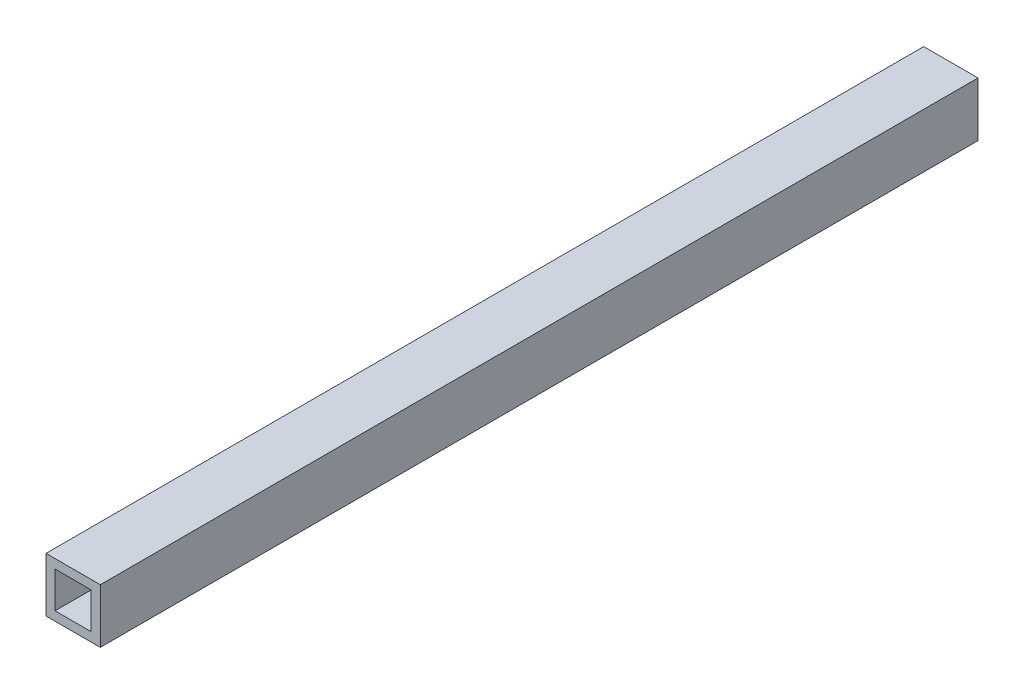
ISO-10303-21;
HEADER;
FILE_DESCRIPTION(('STEP AP214'),'2;1');
FILE_NAME('part.step','',(''),(''),'','','');
FILE_SCHEMA(('AUTOMOTIVE_DESIGN { 1 0 10303 214 1 1 1 1 }'));
ENDSEC;
DATA;
#1=APPLICATION_CONTEXT('core data for automotive mechanical design processes');
#2=APPLICATION_PROTOCOL_DEFINITION('international standard','automotive_design',2000,#1);
#3=PRODUCT_CONTEXT('',#1,'mechanical');
#4=PRODUCT('Part','Part','',(#3));
#5=PRODUCT_RELATED_PRODUCT_CATEGORY('part','',(#4));
#6=PRODUCT_DEFINITION_FORMATION('','',#4);
#7=PRODUCT_DEFINITION_CONTEXT('part definition',#1,'design');
#8=PRODUCT_DEFINITION('design','',#6,#7);
#9=PRODUCT_DEFINITION_SHAPE('','',#8);
#10=(LENGTH_UNIT() NAMED_UNIT(*) SI_UNIT(.MILLI.,.METRE.));
#11=(NAMED_UNIT(*) PLANE_ANGLE_UNIT() SI_UNIT($,.RADIAN.));
#12=(NAMED_UNIT(*) SI_UNIT($,.STERADIAN.) SOLID_ANGLE_UNIT());
#13=UNCERTAINTY_MEASURE_WITH_UNIT(LENGTH_MEASURE(1.E-05),#10,'distance_accuracy_value','');
#14=(GEOMETRIC_REPRESENTATION_CONTEXT(3) GLOBAL_UNCERTAINTY_ASSIGNED_CONTEXT((#13)) GLOBAL_UNIT_ASSIGNED_CONTEXT((#10,
#11,#12)) REPRESENTATION_CONTEXT('',''));
#15=CARTESIAN_POINT('',(0.,0.,0.));
#16=DIRECTION('',(0.,0.,1.));
#17=DIRECTION('',(1.,0.,0.));
#18=AXIS2_PLACEMENT_3D('',#15,#16,#17);
#19=CARTESIAN_POINT('',(0.,0.,153.9875));
#20=DIRECTION('',(0.,0.,-1.));
#21=DIRECTION('',(-1.,0.,0.));
#22=AXIS2_PLACEMENT_3D('',#19,#20,#21);
#23=PLANE('',#22);
#24=DIRECTION('',(0.,1.,0.));
#25=VECTOR('',#24,1.);
#26=CARTESIAN_POINT('',(9.525,-9.525,153.9875));
#27=LINE('',#26,#25);
#28=CARTESIAN_POINT('',(9.525,-9.525,153.9875));
#29=VERTEX_POINT('',#28);
#30=CARTESIAN_POINT('',(9.525,9.525,153.9875));
#31=VERTEX_POINT('',#30);
#32=EDGE_CURVE('E138',#29,#31,#27,.T.);
#33=ORIENTED_EDGE('',*,*,#32,.T.);
#34=DIRECTION('',(-1.,0.,0.));
#35=VECTOR('',#34,1.);
#36=CARTESIAN_POINT('',(-9.525,9.525,153.9875));
#37=LINE('',#36,#35);
#38=CARTESIAN_POINT('',(-9.525,9.525,153.9875));
#39=VERTEX_POINT('',#38);
#40=EDGE_CURVE('E141',#31,#39,#37,.T.);
#41=ORIENTED_EDGE('',*,*,#40,.T.);
#42=DIRECTION('',(0.,-1.,0.));
#43=VECTOR('',#42,1.);
#44=CARTESIAN_POINT('',(-9.525,-9.525,153.9875));
#45=LINE('',#44,#43);
#46=CARTESIAN_POINT('',(-9.525,-9.525,153.9875));
#47=VERTEX_POINT('',#46);
#48=EDGE_CURVE('E144',#39,#47,#45,.T.);
#49=ORIENTED_EDGE('',*,*,#48,.T.);
#50=DIRECTION('',(1.,0.,0.));
#51=VECTOR('',#50,1.);
#52=CARTESIAN_POINT('',(-9.525,-9.525,153.9875));
#53=LINE('',#52,#51);
#54=EDGE_CURVE('E146',#47,#29,#53,.T.);
#55=ORIENTED_EDGE('',*,*,#54,.T.);
#56=EDGE_LOOP('',(#33,#41,#49,#55));
#57=FACE_BOUND('',#56,.T.);
#58=DIRECTION('',(0.,1.,0.));
#59=VECTOR('',#58,1.);
#60=CARTESIAN_POINT('',(6.34999999999999,-6.34999999999999,153.9875));
#61=LINE('',#60,#59);
#62=CARTESIAN_POINT('',(6.34999999999999,-6.34999999999999,153.9875));
#63=VERTEX_POINT('',#62);
#64=CARTESIAN_POINT('',(6.34999999999999,6.35,153.9875));
#65=VERTEX_POINT('',#64);
#66=EDGE_CURVE('E102',#63,#65,#61,.T.);
#67=ORIENTED_EDGE('',*,*,#66,.F.);
#68=DIRECTION('',(1.,0.,0.));
#69=VECTOR('',#68,1.);
#70=CARTESIAN_POINT('',(-6.35,-6.34999999999999,153.9875));
#71=LINE('',#70,#69);
#72=CARTESIAN_POINT('',(-6.35,-6.34999999999999,153.9875));
#73=VERTEX_POINT('',#72);
#74=EDGE_CURVE('E124',#73,#63,#71,.T.);
#75=ORIENTED_EDGE('',*,*,#74,.F.);
#76=DIRECTION('',(0.,-1.,0.));
#77=VECTOR('',#76,1.);
#78=CARTESIAN_POINT('',(-6.35,-6.34999999999999,153.9875));
#79=LINE('',#78,#77);
#80=CARTESIAN_POINT('',(-6.35,6.35,153.9875));
#81=VERTEX_POINT('',#80);
#82=EDGE_CURVE('E122',#81,#73,#79,.T.);
#83=ORIENTED_EDGE('',*,*,#82,.F.);
#84=DIRECTION('',(-1.,0.,0.));
#85=VECTOR('',#84,1.);
#86=CARTESIAN_POINT('',(-6.35,6.35,153.9875));
#87=LINE('',#86,#85);
#88=EDGE_CURVE('E110',#65,#81,#87,.T.);
#89=ORIENTED_EDGE('',*,*,#88,.F.);
#90=EDGE_LOOP('',(#67,#75,#83,#89));
#91=FACE_BOUND('',#90,.T.);
#92=ADVANCED_FACE('F37',(#57,#91),#23,.F.);
#93=CARTESIAN_POINT('',(0.,0.,-153.9875));
#94=DIRECTION('',(0.,0.,-1.));
#95=DIRECTION('',(-1.,0.,0.));
#96=AXIS2_PLACEMENT_3D('',#93,#94,#95);
#97=PLANE('',#96);
#98=DIRECTION('',(0.,1.,0.));
#99=VECTOR('',#98,1.);
#100=CARTESIAN_POINT('',(9.525,-9.525,-153.9875));
#101=LINE('',#100,#99);
#102=CARTESIAN_POINT('',(9.525,-9.525,-153.9875));
#103=VERTEX_POINT('',#102);
#104=CARTESIAN_POINT('',(9.525,9.525,-153.9875));
#105=VERTEX_POINT('',#104);
#106=EDGE_CURVE('E118',#103,#105,#101,.T.);
#107=ORIENTED_EDGE('',*,*,#106,.F.);
#108=DIRECTION('',(1.,0.,0.));
#109=VECTOR('',#108,1.);
#110=CARTESIAN_POINT('',(-9.525,-9.525,-153.9875));
#111=LINE('',#110,#109);
#112=CARTESIAN_POINT('',(-9.525,-9.525,-153.9875));
#113=VERTEX_POINT('',#112);
#114=EDGE_CURVE('E142',#113,#103,#111,.T.);
#115=ORIENTED_EDGE('',*,*,#114,.F.);
#116=DIRECTION('',(0.,-1.,0.));
#117=VECTOR('',#116,1.);
#118=CARTESIAN_POINT('',(-9.525,-9.525,-153.9875));
#119=LINE('',#118,#117);
#120=CARTESIAN_POINT('',(-9.525,9.525,-153.9875));
#121=VERTEX_POINT('',#120);
#122=EDGE_CURVE('E153',#121,#113,#119,.T.);
#123=ORIENTED_EDGE('',*,*,#122,.F.);
#124=DIRECTION('',(-1.,0.,0.));
#125=VECTOR('',#124,1.);
#126=CARTESIAN_POINT('',(-9.525,9.525,-153.9875));
#127=LINE('',#126,#125);
#128=EDGE_CURVE('E151',#105,#121,#127,.T.);
#129=ORIENTED_EDGE('',*,*,#128,.F.);
#130=EDGE_LOOP('',(#107,#115,#123,#129));
#131=FACE_BOUND('',#130,.T.);
#132=DIRECTION('',(1.,0.,0.));
#133=VECTOR('',#132,1.);
#134=CARTESIAN_POINT('',(-6.35,-6.34999999999999,-153.9875));
#135=LINE('',#134,#133);
#136=CARTESIAN_POINT('',(-6.35,-6.34999999999999,-153.9875));
#137=VERTEX_POINT('',#136);
#138=CARTESIAN_POINT('',(6.34999999999999,-6.34999999999999,-153.9875));
#139=VERTEX_POINT('',#138);
#140=EDGE_CURVE('E111',#137,#139,#135,.T.);
#141=ORIENTED_EDGE('',*,*,#140,.T.);
#142=DIRECTION('',(0.,1.,0.));
#143=VECTOR('',#142,1.);
#144=CARTESIAN_POINT('',(6.34999999999999,-6.34999999999999,-153.9875));
#145=LINE('',#144,#143);
#146=CARTESIAN_POINT('',(6.34999999999999,6.35,-153.9875));
#147=VERTEX_POINT('',#146);
#148=EDGE_CURVE('E60',#139,#147,#145,.T.);
#149=ORIENTED_EDGE('',*,*,#148,.T.);
#150=DIRECTION('',(-1.,0.,0.));
#151=VECTOR('',#150,1.);
#152=CARTESIAN_POINT('',(-6.35,6.35,-153.9875));
#153=LINE('',#152,#151);
#154=CARTESIAN_POINT('',(-6.35,6.35,-153.9875));
#155=VERTEX_POINT('',#154);
#156=EDGE_CURVE('E117',#147,#155,#153,.T.);
#157=ORIENTED_EDGE('',*,*,#156,.T.);
#158=DIRECTION('',(0.,-1.,0.));
#159=VECTOR('',#158,1.);
#160=CARTESIAN_POINT('',(-6.35,-6.34999999999999,-153.9875));
#161=LINE('',#160,#159);
#162=EDGE_CURVE('E130',#155,#137,#161,.T.);
#163=ORIENTED_EDGE('',*,*,#162,.T.);
#164=EDGE_LOOP('',(#141,#149,#157,#163));
#165=FACE_BOUND('',#164,.T.);
#166=ADVANCED_FACE('F171',(#131,#165),#97,.T.);
#167=CARTESIAN_POINT('',(9.525,-9.525,153.9875));
#168=DIRECTION('',(-1.,0.,0.));
#169=DIRECTION('',(0.,0.,1.));
#170=AXIS2_PLACEMENT_3D('',#167,#168,#169);
#171=PLANE('',#170);
#172=ORIENTED_EDGE('',*,*,#106,.T.);
#173=DIRECTION('',(0.,0.,-1.));
#174=VECTOR('',#173,1.);
#175=CARTESIAN_POINT('',(9.525,9.525,153.9875));
#176=LINE('',#175,#174);
#177=EDGE_CURVE('E11',#31,#105,#176,.T.);
#178=ORIENTED_EDGE('',*,*,#177,.F.);
#179=ORIENTED_EDGE('',*,*,#32,.F.);
#180=DIRECTION('',(0.,0.,-1.));
#181=VECTOR('',#180,1.);
#182=CARTESIAN_POINT('',(9.525,-9.525,153.9875));
#183=LINE('',#182,#181);
#184=EDGE_CURVE('E148',#29,#103,#183,.T.);
#185=ORIENTED_EDGE('',*,*,#184,.T.);
#186=EDGE_LOOP('',(#172,#178,#179,#185));
#187=FACE_BOUND('',#186,.T.);
#188=ADVANCED_FACE('F39',(#187),#171,.F.);
#189=CARTESIAN_POINT('',(-9.525,9.525,153.9875));
#190=DIRECTION('',(0.,-1.,0.));
#191=DIRECTION('',(0.,0.,-1.));
#192=AXIS2_PLACEMENT_3D('',#189,#190,#191);
#193=PLANE('',#192);
#194=ORIENTED_EDGE('',*,*,#128,.T.);
#195=DIRECTION('',(0.,0.,-1.));
#196=VECTOR('',#195,1.);
#197=CARTESIAN_POINT('',(-9.525,9.525,153.9875));
#198=LINE('',#197,#196);
#199=EDGE_CURVE('E45',#39,#121,#198,.T.);
#200=ORIENTED_EDGE('',*,*,#199,.F.);
#201=ORIENTED_EDGE('',*,*,#40,.F.);
#202=ORIENTED_EDGE('',*,*,#177,.T.);
#203=EDGE_LOOP('',(#194,#200,#201,#202));
#204=FACE_BOUND('',#203,.T.);
#205=ADVANCED_FACE('F181',(#204),#193,.F.);
#206=CARTESIAN_POINT('',(-9.525,-9.525,153.9875));
#207=DIRECTION('',(1.,0.,0.));
#208=DIRECTION('',(0.,1.,0.));
#209=AXIS2_PLACEMENT_3D('',#206,#207,#208);
#210=PLANE('',#209);
#211=ORIENTED_EDGE('',*,*,#122,.T.);
#212=DIRECTION('',(0.,0.,-1.));
#213=VECTOR('',#212,1.);
#214=CARTESIAN_POINT('',(-9.525,-9.525,153.9875));
#215=LINE('',#214,#213);
#216=EDGE_CURVE('E158',#47,#113,#215,.T.);
#217=ORIENTED_EDGE('',*,*,#216,.F.);
#218=ORIENTED_EDGE('',*,*,#48,.F.);
#219=ORIENTED_EDGE('',*,*,#199,.T.);
#220=EDGE_LOOP('',(#211,#217,#218,#219));
#221=FACE_BOUND('',#220,.T.);
#222=ADVANCED_FACE('F165',(#221),#210,.F.);
#223=CARTESIAN_POINT('',(-9.525,-9.525,153.9875));
#224=DIRECTION('',(0.,1.,0.));
#225=DIRECTION('',(0.,0.,1.));
#226=AXIS2_PLACEMENT_3D('',#223,#224,#225);
#227=PLANE('',#226);
#228=ORIENTED_EDGE('',*,*,#114,.T.);
#229=ORIENTED_EDGE('',*,*,#184,.F.);
#230=ORIENTED_EDGE('',*,*,#54,.F.);
#231=ORIENTED_EDGE('',*,*,#216,.T.);
#232=EDGE_LOOP('',(#228,#229,#230,#231));
#233=FACE_BOUND('',#232,.T.);
#234=ADVANCED_FACE('F175',(#233),#227,.F.);
#235=CARTESIAN_POINT('',(6.34999999999999,-6.34999999999999,153.9875));
#236=DIRECTION('',(-1.,0.,0.));
#237=DIRECTION('',(0.,0.,1.));
#238=AXIS2_PLACEMENT_3D('',#235,#236,#237);
#239=PLANE('',#238);
#240=ORIENTED_EDGE('',*,*,#148,.F.);
#241=DIRECTION('',(0.,0.,-1.));
#242=VECTOR('',#241,1.);
#243=CARTESIAN_POINT('',(6.34999999999999,-6.34999999999999,153.9875));
#244=LINE('',#243,#242);
#245=EDGE_CURVE('E106',#63,#139,#244,.T.);
#246=ORIENTED_EDGE('',*,*,#245,.F.);
#247=ORIENTED_EDGE('',*,*,#66,.T.);
#248=DIRECTION('',(0.,0.,-1.));
#249=VECTOR('',#248,1.);
#250=CARTESIAN_POINT('',(6.34999999999999,6.35,153.9875));
#251=LINE('',#250,#249);
#252=EDGE_CURVE('E105',#65,#147,#251,.T.);
#253=ORIENTED_EDGE('',*,*,#252,.T.);
#254=EDGE_LOOP('',(#240,#246,#247,#253));
#255=FACE_BOUND('',#254,.T.);
#256=ADVANCED_FACE('F104',(#255),#239,.T.);
#257=CARTESIAN_POINT('',(-6.35,6.35,153.9875));
#258=DIRECTION('',(0.,-1.,0.));
#259=DIRECTION('',(0.,0.,-1.));
#260=AXIS2_PLACEMENT_3D('',#257,#258,#259);
#261=PLANE('',#260);
#262=ORIENTED_EDGE('',*,*,#156,.F.);
#263=ORIENTED_EDGE('',*,*,#252,.F.);
#264=ORIENTED_EDGE('',*,*,#88,.T.);
#265=DIRECTION('',(0.,0.,-1.));
#266=VECTOR('',#265,1.);
#267=CARTESIAN_POINT('',(-6.35,6.35,153.9875));
#268=LINE('',#267,#266);
#269=EDGE_CURVE('E119',#81,#155,#268,.T.);
#270=ORIENTED_EDGE('',*,*,#269,.T.);
#271=EDGE_LOOP('',(#262,#263,#264,#270));
#272=FACE_BOUND('',#271,.T.);
#273=ADVANCED_FACE('F114',(#272),#261,.T.);
#274=CARTESIAN_POINT('',(-6.35,-6.34999999999999,153.9875));
#275=DIRECTION('',(1.,0.,0.));
#276=DIRECTION('',(0.,0.,-1.));
#277=AXIS2_PLACEMENT_3D('',#274,#275,#276);
#278=PLANE('',#277);
#279=ORIENTED_EDGE('',*,*,#162,.F.);
#280=ORIENTED_EDGE('',*,*,#269,.F.);
#281=ORIENTED_EDGE('',*,*,#82,.T.);
#282=DIRECTION('',(0.,0.,-1.));
#283=VECTOR('',#282,1.);
#284=CARTESIAN_POINT('',(-6.35,-6.34999999999999,153.9875));
#285=LINE('',#284,#283);
#286=EDGE_CURVE('E52',#73,#137,#285,.T.);
#287=ORIENTED_EDGE('',*,*,#286,.T.);
#288=EDGE_LOOP('',(#279,#280,#281,#287));
#289=FACE_BOUND('',#288,.T.);
#290=ADVANCED_FACE('F204',(#289),#278,.T.);
#291=CARTESIAN_POINT('',(-6.35,-6.34999999999999,153.9875));
#292=DIRECTION('',(0.,1.,0.));
#293=DIRECTION('',(0.,0.,1.));
#294=AXIS2_PLACEMENT_3D('',#291,#292,#293);
#295=PLANE('',#294);
#296=ORIENTED_EDGE('',*,*,#140,.F.);
#297=ORIENTED_EDGE('',*,*,#286,.F.);
#298=ORIENTED_EDGE('',*,*,#74,.T.);
#299=ORIENTED_EDGE('',*,*,#245,.T.);
#300=EDGE_LOOP('',(#296,#297,#298,#299));
#301=FACE_BOUND('',#300,.T.);
#302=ADVANCED_FACE('F208',(#301),#295,.T.);
#303=CLOSED_SHELL('',(#92,#166,#188,#205,#222,#234,#256,#273,#290,#302));
#304=MANIFOLD_SOLID_BREP('B2',#303);
#305=ADVANCED_BREP_SHAPE_REPRESENTATION('',(#18,#304),#14);
#306=SHAPE_DEFINITION_REPRESENTATION(#9,#305);
ENDSEC;
END-ISO-10303-21;
